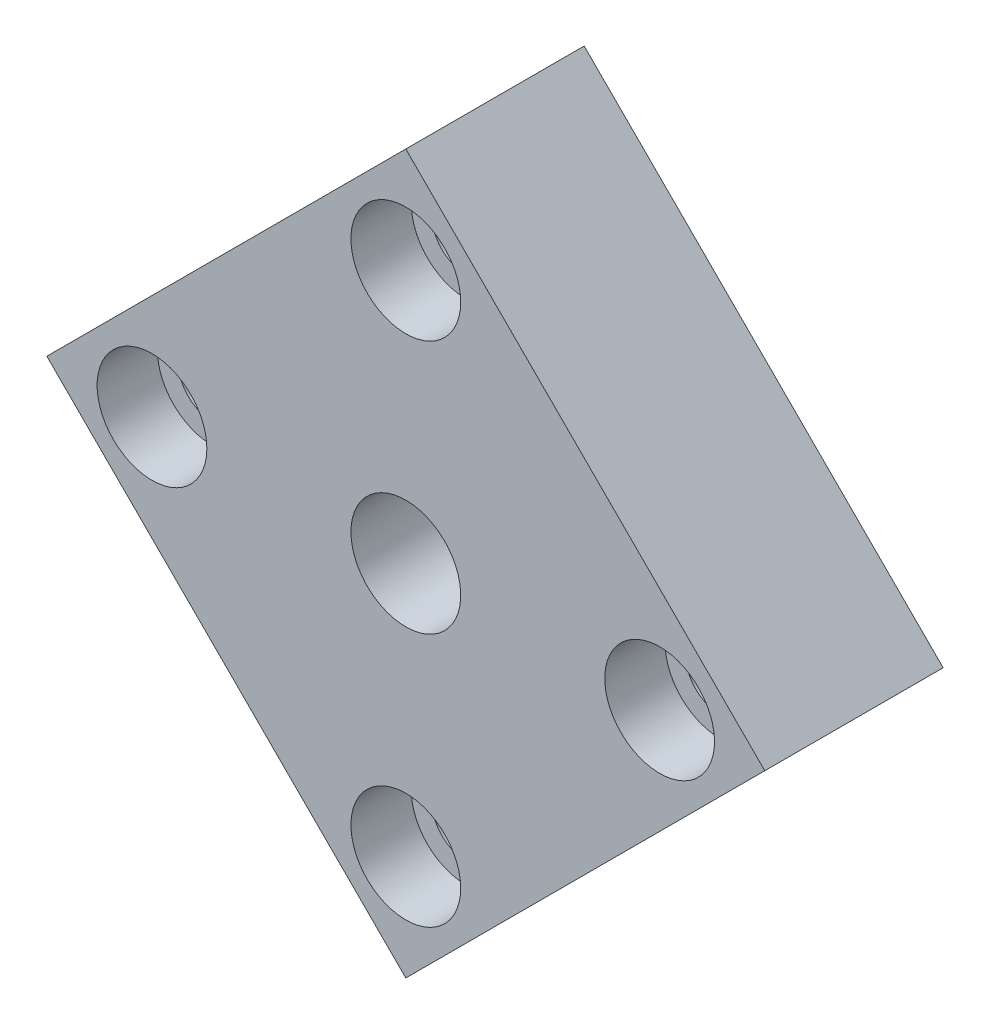
ISO-10303-21;
HEADER;
FILE_DESCRIPTION(('STEP AP214'),'2;1');
FILE_NAME('part.step','',(''),(''),'','','');
FILE_SCHEMA(('AUTOMOTIVE_DESIGN { 1 0 10303 214 1 1 1 1 }'));
ENDSEC;
DATA;
#1=APPLICATION_CONTEXT('core data for automotive mechanical design processes');
#2=APPLICATION_PROTOCOL_DEFINITION('international standard','automotive_design',2000,#1);
#3=PRODUCT_CONTEXT('',#1,'mechanical');
#4=PRODUCT('Part','Part','',(#3));
#5=PRODUCT_RELATED_PRODUCT_CATEGORY('part','',(#4));
#6=PRODUCT_DEFINITION_FORMATION('','',#4);
#7=PRODUCT_DEFINITION_CONTEXT('part definition',#1,'design');
#8=PRODUCT_DEFINITION('design','',#6,#7);
#9=PRODUCT_DEFINITION_SHAPE('','',#8);
#10=(LENGTH_UNIT() NAMED_UNIT(*) SI_UNIT(.MILLI.,.METRE.));
#11=(NAMED_UNIT(*) PLANE_ANGLE_UNIT() SI_UNIT($,.RADIAN.));
#12=(NAMED_UNIT(*) SI_UNIT($,.STERADIAN.) SOLID_ANGLE_UNIT());
#13=UNCERTAINTY_MEASURE_WITH_UNIT(LENGTH_MEASURE(1.E-05),#10,'distance_accuracy_value','');
#14=(GEOMETRIC_REPRESENTATION_CONTEXT(3) GLOBAL_UNCERTAINTY_ASSIGNED_CONTEXT((#13)) GLOBAL_UNIT_ASSIGNED_CONTEXT((#10,
#11,#12)) REPRESENTATION_CONTEXT('',''));
#15=CARTESIAN_POINT('',(0.,0.,0.));
#16=DIRECTION('',(0.,0.,1.));
#17=DIRECTION('',(1.,0.,0.));
#18=AXIS2_PLACEMENT_3D('',#15,#16,#17);
#19=CARTESIAN_POINT('',(18.5000000000002,0.,13.));
#20=DIRECTION('',(0.,0.,-1.));
#21=DIRECTION('',(-1.,0.,0.));
#22=AXIS2_PLACEMENT_3D('',#19,#20,#21);
#23=CYLINDRICAL_SURFACE('',#22,2.5);
#24=CARTESIAN_POINT('',(18.5000000000002,0.,0.));
#25=DIRECTION('',(0.,0.,1.));
#26=DIRECTION('',(1.,0.,0.));
#27=AXIS2_PLACEMENT_3D('',#24,#25,#26);
#28=CIRCLE('',#27,2.5);
#29=CARTESIAN_POINT('',(16.0000000000002,0.,0.));
#30=VERTEX_POINT('',#29);
#31=EDGE_CURVE('E111',#30,#30,#28,.T.);
#32=CARTESIAN_POINT('',(18.5000000000002,0.,8.6));
#33=DIRECTION('',(0.,0.,1.));
#34=DIRECTION('',(1.,0.,0.));
#35=AXIS2_PLACEMENT_3D('',#32,#33,#34);
#36=CIRCLE('',#35,2.5);
#37=CARTESIAN_POINT('',(16.0000000000002,0.,8.6));
#38=VERTEX_POINT('',#37);
#39=EDGE_CURVE('E45',#38,#38,#36,.T.);
#40=CARTESIAN_POINT('',(16.0000000000002,0.,0.));
#41=CARTESIAN_POINT('',(16.0000000000002,0.,0.0895833333333333));
#42=CARTESIAN_POINT('',(16.0000000000002,0.,0.179166666666667));
#43=CARTESIAN_POINT('',(16.0000000000002,0.,0.358333333333333));
#44=CARTESIAN_POINT('',(16.0000000000002,0.,0.447916666666666));
#45=CARTESIAN_POINT('',(16.0000000000002,0.,0.627083333333333));
#46=CARTESIAN_POINT('',(16.0000000000002,0.,0.716666666666666));
#47=CARTESIAN_POINT('',(16.0000000000002,0.,0.895833333333333));
#48=CARTESIAN_POINT('',(16.0000000000002,0.,0.985416666666666));
#49=CARTESIAN_POINT('',(16.0000000000002,0.,1.16458333333333));
#50=CARTESIAN_POINT('',(16.0000000000002,0.,1.25416666666667));
#51=CARTESIAN_POINT('',(16.0000000000002,0.,1.43333333333333));
#52=CARTESIAN_POINT('',(16.0000000000002,0.,1.52291666666667));
#53=CARTESIAN_POINT('',(16.0000000000002,0.,1.70208333333333));
#54=CARTESIAN_POINT('',(16.0000000000002,0.,1.79166666666667));
#55=CARTESIAN_POINT('',(16.0000000000002,0.,1.97083333333333));
#56=CARTESIAN_POINT('',(16.0000000000002,0.,2.06041666666667));
#57=CARTESIAN_POINT('',(16.0000000000002,0.,2.23958333333333));
#58=CARTESIAN_POINT('',(16.0000000000002,0.,2.32916666666667));
#59=CARTESIAN_POINT('',(16.0000000000002,0.,2.50833333333333));
#60=CARTESIAN_POINT('',(16.0000000000002,0.,2.59791666666667));
#61=CARTESIAN_POINT('',(16.0000000000002,0.,2.77708333333333));
#62=CARTESIAN_POINT('',(16.0000000000002,0.,2.86666666666667));
#63=CARTESIAN_POINT('',(16.0000000000002,0.,3.04583333333333));
#64=CARTESIAN_POINT('',(16.0000000000002,0.,3.13541666666667));
#65=CARTESIAN_POINT('',(16.0000000000002,0.,3.31458333333333));
#66=CARTESIAN_POINT('',(16.0000000000002,0.,3.40416666666667));
#67=CARTESIAN_POINT('',(16.0000000000002,0.,3.58333333333333));
#68=CARTESIAN_POINT('',(16.0000000000002,0.,3.67291666666667));
#69=CARTESIAN_POINT('',(16.0000000000002,0.,3.85208333333333));
#70=CARTESIAN_POINT('',(16.0000000000002,0.,3.94166666666667));
#71=CARTESIAN_POINT('',(16.0000000000002,0.,4.12083333333333));
#72=CARTESIAN_POINT('',(16.0000000000002,0.,4.21041666666667));
#73=CARTESIAN_POINT('',(16.0000000000002,0.,4.38958333333333));
#74=CARTESIAN_POINT('',(16.0000000000002,0.,4.47916666666667));
#75=CARTESIAN_POINT('',(16.0000000000002,0.,4.65833333333333));
#76=CARTESIAN_POINT('',(16.0000000000002,0.,4.74791666666667));
#77=CARTESIAN_POINT('',(16.0000000000002,0.,4.92708333333333));
#78=CARTESIAN_POINT('',(16.0000000000002,0.,5.01666666666667));
#79=CARTESIAN_POINT('',(16.0000000000002,0.,5.19583333333333));
#80=CARTESIAN_POINT('',(16.0000000000002,0.,5.28541666666667));
#81=CARTESIAN_POINT('',(16.0000000000002,0.,5.46458333333333));
#82=CARTESIAN_POINT('',(16.0000000000002,0.,5.55416666666667));
#83=CARTESIAN_POINT('',(16.0000000000002,0.,5.73333333333333));
#84=CARTESIAN_POINT('',(16.0000000000002,0.,5.82291666666667));
#85=CARTESIAN_POINT('',(16.0000000000002,0.,6.00208333333333));
#86=CARTESIAN_POINT('',(16.0000000000002,0.,6.09166666666667));
#87=CARTESIAN_POINT('',(16.0000000000002,0.,6.27083333333333));
#88=CARTESIAN_POINT('',(16.0000000000002,0.,6.36041666666667));
#89=CARTESIAN_POINT('',(16.0000000000002,0.,6.53958333333333));
#90=CARTESIAN_POINT('',(16.0000000000002,0.,6.62916666666667));
#91=CARTESIAN_POINT('',(16.0000000000002,0.,6.80833333333333));
#92=CARTESIAN_POINT('',(16.0000000000002,0.,6.89791666666667));
#93=CARTESIAN_POINT('',(16.0000000000002,0.,7.07708333333333));
#94=CARTESIAN_POINT('',(16.0000000000002,0.,7.16666666666667));
#95=CARTESIAN_POINT('',(16.0000000000002,0.,7.34583333333333));
#96=CARTESIAN_POINT('',(16.0000000000002,0.,7.43541666666667));
#97=CARTESIAN_POINT('',(16.0000000000002,0.,7.61458333333333));
#98=CARTESIAN_POINT('',(16.0000000000002,0.,7.70416666666667));
#99=CARTESIAN_POINT('',(16.0000000000002,0.,7.88333333333333));
#100=CARTESIAN_POINT('',(16.0000000000002,0.,7.97291666666667));
#101=CARTESIAN_POINT('',(16.0000000000002,0.,8.15208333333333));
#102=CARTESIAN_POINT('',(16.0000000000002,0.,8.24166666666667));
#103=CARTESIAN_POINT('',(16.0000000000002,0.,8.42083333333333));
#104=CARTESIAN_POINT('',(16.0000000000002,0.,8.51041666666667));
#105=CARTESIAN_POINT('',(16.0000000000002,0.,8.6));
#106=B_SPLINE_CURVE_WITH_KNOTS('',3,(#40,#41,#42,#43,#44,#45,#46,#47,#48,#49,#50,#51,#52,#53,
#54,#55,#56,#57,#58,#59,#60,#61,#62,#63,#64,#65,#66,#67,#68,#69,#70,#71,#72,#73,#74,#75,#76,#77,
#78,#79,#80,#81,#82,#83,#84,#85,#86,#87,#88,#89,#90,#91,#92,#93,#94,#95,#96,#97,#98,#99,#100,
#101,#102,#103,#104,#105),.UNSPECIFIED.,.F.,.F.,(4,2,2,2,2,2,2,2,2,2,2,2,2,2,2,2,2,2,2,2,2,2,2,
2,2,2,2,2,2,2,2,2,4),(0.,0.26875,0.5375,0.80625,1.075,1.34375,1.6125,1.88125,2.15,2.41875,
2.6875,2.95625,3.225,3.49375,3.7625,4.03125,4.3,4.56875,4.8375,5.10625,5.375,5.64375,5.9125,
6.18125,6.45,6.71875,6.9875,7.25625,7.525,7.79375,8.0625,8.33125,8.6),.UNSPECIFIED.);
#107=EDGE_CURVE('BSEAM41',#30,#38,#106,.T.);
#108=ORIENTED_EDGE('',*,*,#31,.F.);
#109=ORIENTED_EDGE('',*,*,#39,.T.);
#110=ORIENTED_EDGE('',*,*,#107,.T.);
#111=ORIENTED_EDGE('',*,*,#107,.F.);
#112=EDGE_LOOP('',(#108,#110,#109,#111));
#113=FACE_BOUND('',#112,.T.);
#114=ADVANCED_FACE('F41',(#113),#23,.F.);
#115=CARTESIAN_POINT('',(0.,-18.5000000000002,13.));
#116=DIRECTION('',(0.,0.,-1.));
#117=DIRECTION('',(-1.,0.,0.));
#118=AXIS2_PLACEMENT_3D('',#115,#116,#117);
#119=CYLINDRICAL_SURFACE('',#118,2.5);
#120=CARTESIAN_POINT('',(0.,-18.5000000000002,0.));
#121=DIRECTION('',(0.,0.,1.));
#122=DIRECTION('',(1.,0.,0.));
#123=AXIS2_PLACEMENT_3D('',#120,#121,#122);
#124=CIRCLE('',#123,2.5);
#125=CARTESIAN_POINT('',(-2.50000000000006,-18.5000000000002,0.));
#126=VERTEX_POINT('',#125);
#127=EDGE_CURVE('E137',#126,#126,#124,.T.);
#128=CARTESIAN_POINT('',(0.,-18.5000000000002,8.6));
#129=DIRECTION('',(0.,0.,1.));
#130=DIRECTION('',(1.,0.,0.));
#131=AXIS2_PLACEMENT_3D('',#128,#129,#130);
#132=CIRCLE('',#131,2.5);
#133=CARTESIAN_POINT('',(-2.50000000000006,-18.5000000000002,8.6));
#134=VERTEX_POINT('',#133);
#135=EDGE_CURVE('E123',#134,#134,#132,.T.);
#136=CARTESIAN_POINT('',(-2.50000000000006,-18.5000000000002,0.));
#137=CARTESIAN_POINT('',(-2.50000000000006,-18.5000000000002,0.0895833333333333));
#138=CARTESIAN_POINT('',(-2.50000000000006,-18.5000000000002,0.179166666666667));
#139=CARTESIAN_POINT('',(-2.50000000000006,-18.5000000000002,0.358333333333333));
#140=CARTESIAN_POINT('',(-2.50000000000006,-18.5000000000002,0.447916666666666));
#141=CARTESIAN_POINT('',(-2.50000000000006,-18.5000000000002,0.627083333333333));
#142=CARTESIAN_POINT('',(-2.50000000000006,-18.5000000000002,0.716666666666666));
#143=CARTESIAN_POINT('',(-2.50000000000006,-18.5000000000002,0.895833333333333));
#144=CARTESIAN_POINT('',(-2.50000000000006,-18.5000000000002,0.985416666666666));
#145=CARTESIAN_POINT('',(-2.50000000000006,-18.5000000000002,1.16458333333333));
#146=CARTESIAN_POINT('',(-2.50000000000006,-18.5000000000002,1.25416666666667));
#147=CARTESIAN_POINT('',(-2.50000000000006,-18.5000000000002,1.43333333333333));
#148=CARTESIAN_POINT('',(-2.50000000000006,-18.5000000000002,1.52291666666667));
#149=CARTESIAN_POINT('',(-2.50000000000006,-18.5000000000002,1.70208333333333));
#150=CARTESIAN_POINT('',(-2.50000000000006,-18.5000000000002,1.79166666666667));
#151=CARTESIAN_POINT('',(-2.50000000000006,-18.5000000000002,1.97083333333333));
#152=CARTESIAN_POINT('',(-2.50000000000006,-18.5000000000002,2.06041666666667));
#153=CARTESIAN_POINT('',(-2.50000000000006,-18.5000000000002,2.23958333333333));
#154=CARTESIAN_POINT('',(-2.50000000000006,-18.5000000000002,2.32916666666667));
#155=CARTESIAN_POINT('',(-2.50000000000006,-18.5000000000002,2.50833333333333));
#156=CARTESIAN_POINT('',(-2.50000000000006,-18.5000000000002,2.59791666666667));
#157=CARTESIAN_POINT('',(-2.50000000000006,-18.5000000000002,2.77708333333333));
#158=CARTESIAN_POINT('',(-2.50000000000006,-18.5000000000002,2.86666666666667));
#159=CARTESIAN_POINT('',(-2.50000000000006,-18.5000000000002,3.04583333333333));
#160=CARTESIAN_POINT('',(-2.50000000000006,-18.5000000000002,3.13541666666667));
#161=CARTESIAN_POINT('',(-2.50000000000006,-18.5000000000002,3.31458333333333));
#162=CARTESIAN_POINT('',(-2.50000000000006,-18.5000000000002,3.40416666666667));
#163=CARTESIAN_POINT('',(-2.50000000000006,-18.5000000000002,3.58333333333333));
#164=CARTESIAN_POINT('',(-2.50000000000006,-18.5000000000002,3.67291666666667));
#165=CARTESIAN_POINT('',(-2.50000000000006,-18.5000000000002,3.85208333333333));
#166=CARTESIAN_POINT('',(-2.50000000000006,-18.5000000000002,3.94166666666667));
#167=CARTESIAN_POINT('',(-2.50000000000006,-18.5000000000002,4.12083333333333));
#168=CARTESIAN_POINT('',(-2.50000000000006,-18.5000000000002,4.21041666666667));
#169=CARTESIAN_POINT('',(-2.50000000000006,-18.5000000000002,4.38958333333333));
#170=CARTESIAN_POINT('',(-2.50000000000006,-18.5000000000002,4.47916666666667));
#171=CARTESIAN_POINT('',(-2.50000000000006,-18.5000000000002,4.65833333333333));
#172=CARTESIAN_POINT('',(-2.50000000000006,-18.5000000000002,4.74791666666667));
#173=CARTESIAN_POINT('',(-2.50000000000006,-18.5000000000002,4.92708333333333));
#174=CARTESIAN_POINT('',(-2.50000000000006,-18.5000000000002,5.01666666666667));
#175=CARTESIAN_POINT('',(-2.50000000000006,-18.5000000000002,5.19583333333333));
#176=CARTESIAN_POINT('',(-2.50000000000006,-18.5000000000002,5.28541666666667));
#177=CARTESIAN_POINT('',(-2.50000000000006,-18.5000000000002,5.46458333333333));
#178=CARTESIAN_POINT('',(-2.50000000000006,-18.5000000000002,5.55416666666667));
#179=CARTESIAN_POINT('',(-2.50000000000006,-18.5000000000002,5.73333333333333));
#180=CARTESIAN_POINT('',(-2.50000000000006,-18.5000000000002,5.82291666666667));
#181=CARTESIAN_POINT('',(-2.50000000000006,-18.5000000000002,6.00208333333333));
#182=CARTESIAN_POINT('',(-2.50000000000006,-18.5000000000002,6.09166666666667));
#183=CARTESIAN_POINT('',(-2.50000000000006,-18.5000000000002,6.27083333333333));
#184=CARTESIAN_POINT('',(-2.50000000000006,-18.5000000000002,6.36041666666667));
#185=CARTESIAN_POINT('',(-2.50000000000006,-18.5000000000002,6.53958333333333));
#186=CARTESIAN_POINT('',(-2.50000000000006,-18.5000000000002,6.62916666666667));
#187=CARTESIAN_POINT('',(-2.50000000000006,-18.5000000000002,6.80833333333333));
#188=CARTESIAN_POINT('',(-2.50000000000006,-18.5000000000002,6.89791666666667));
#189=CARTESIAN_POINT('',(-2.50000000000006,-18.5000000000002,7.07708333333333));
#190=CARTESIAN_POINT('',(-2.50000000000006,-18.5000000000002,7.16666666666667));
#191=CARTESIAN_POINT('',(-2.50000000000006,-18.5000000000002,7.34583333333333));
#192=CARTESIAN_POINT('',(-2.50000000000006,-18.5000000000002,7.43541666666667));
#193=CARTESIAN_POINT('',(-2.50000000000006,-18.5000000000002,7.61458333333333));
#194=CARTESIAN_POINT('',(-2.50000000000006,-18.5000000000002,7.70416666666667));
#195=CARTESIAN_POINT('',(-2.50000000000006,-18.5000000000002,7.88333333333333));
#196=CARTESIAN_POINT('',(-2.50000000000006,-18.5000000000002,7.97291666666667));
#197=CARTESIAN_POINT('',(-2.50000000000006,-18.5000000000002,8.15208333333333));
#198=CARTESIAN_POINT('',(-2.50000000000006,-18.5000000000002,8.24166666666667));
#199=CARTESIAN_POINT('',(-2.50000000000006,-18.5000000000002,8.42083333333333));
#200=CARTESIAN_POINT('',(-2.50000000000006,-18.5000000000002,8.51041666666667));
#201=CARTESIAN_POINT('',(-2.50000000000006,-18.5000000000002,8.6));
#202=B_SPLINE_CURVE_WITH_KNOTS('',3,(#136,#137,#138,#139,#140,#141,#142,#143,#144,#145,#146,
#147,#148,#149,#150,#151,#152,#153,#154,#155,#156,#157,#158,#159,#160,#161,#162,#163,#164,#165,
#166,#167,#168,#169,#170,#171,#172,#173,#174,#175,#176,#177,#178,#179,#180,#181,#182,#183,#184,
#185,#186,#187,#188,#189,#190,#191,#192,#193,#194,#195,#196,#197,#198,#199,#200,#201),
.UNSPECIFIED.,.F.,.F.,(4,2,2,2,2,2,2,2,2,2,2,2,2,2,2,2,2,2,2,2,2,2,2,2,2,2,2,2,2,2,2,2,4),(0.,
0.26875,0.5375,0.80625,1.075,1.34375,1.6125,1.88125,2.15,2.41875,2.6875,2.95625,3.225,3.49375,
3.7625,4.03125,4.3,4.56875,4.8375,5.10625,5.375,5.64375,5.9125,6.18125,6.45,6.71875,6.9875,
7.25625,7.525,7.79375,8.0625,8.33125,8.6),.UNSPECIFIED.);
#203=EDGE_CURVE('BSEAM158',#126,#134,#202,.T.);
#204=ORIENTED_EDGE('',*,*,#127,.F.);
#205=ORIENTED_EDGE('',*,*,#135,.T.);
#206=ORIENTED_EDGE('',*,*,#203,.T.);
#207=ORIENTED_EDGE('',*,*,#203,.F.);
#208=EDGE_LOOP('',(#204,#206,#205,#207));
#209=FACE_BOUND('',#208,.T.);
#210=ADVANCED_FACE('F158',(#209),#119,.F.);
#211=CARTESIAN_POINT('',(-18.5000000000002,1.29184809537197E-13,13.));
#212=DIRECTION('',(0.,0.,-1.));
#213=DIRECTION('',(-1.,0.,0.));
#214=AXIS2_PLACEMENT_3D('',#211,#212,#213);
#215=CYLINDRICAL_SURFACE('',#214,2.5);
#216=CARTESIAN_POINT('',(-18.5000000000002,1.29184809537197E-13,0.));
#217=DIRECTION('',(0.,0.,1.));
#218=DIRECTION('',(1.,0.,0.));
#219=AXIS2_PLACEMENT_3D('',#216,#217,#218);
#220=CIRCLE('',#219,2.5);
#221=CARTESIAN_POINT('',(-21.0000000000001,1.29184809537197E-13,0.));
#222=VERTEX_POINT('',#221);
#223=EDGE_CURVE('E132',#222,#222,#220,.T.);
#224=CARTESIAN_POINT('',(-18.5000000000002,1.29184809537197E-13,8.6));
#225=DIRECTION('',(0.,0.,1.));
#226=DIRECTION('',(1.,0.,0.));
#227=AXIS2_PLACEMENT_3D('',#224,#225,#226);
#228=CIRCLE('',#227,2.5);
#229=CARTESIAN_POINT('',(-21.0000000000001,1.29184809537197E-13,8.6));
#230=VERTEX_POINT('',#229);
#231=EDGE_CURVE('E120',#230,#230,#228,.T.);
#232=CARTESIAN_POINT('',(-21.0000000000001,1.29184809537197E-13,0.));
#233=CARTESIAN_POINT('',(-21.0000000000001,1.29184809537197E-13,0.0895833333333333));
#234=CARTESIAN_POINT('',(-21.0000000000001,1.29184809537197E-13,0.179166666666667));
#235=CARTESIAN_POINT('',(-21.0000000000001,1.29184809537197E-13,0.358333333333333));
#236=CARTESIAN_POINT('',(-21.0000000000001,1.29184809537197E-13,0.447916666666666));
#237=CARTESIAN_POINT('',(-21.0000000000001,1.29184809537197E-13,0.627083333333333));
#238=CARTESIAN_POINT('',(-21.0000000000001,1.29184809537197E-13,0.716666666666666));
#239=CARTESIAN_POINT('',(-21.0000000000001,1.29184809537197E-13,0.895833333333333));
#240=CARTESIAN_POINT('',(-21.0000000000001,1.29184809537197E-13,0.985416666666666));
#241=CARTESIAN_POINT('',(-21.0000000000001,1.29184809537197E-13,1.16458333333333));
#242=CARTESIAN_POINT('',(-21.0000000000001,1.29184809537197E-13,1.25416666666667));
#243=CARTESIAN_POINT('',(-21.0000000000001,1.29184809537197E-13,1.43333333333333));
#244=CARTESIAN_POINT('',(-21.0000000000001,1.29184809537197E-13,1.52291666666667));
#245=CARTESIAN_POINT('',(-21.0000000000001,1.29184809537197E-13,1.70208333333333));
#246=CARTESIAN_POINT('',(-21.0000000000001,1.29184809537197E-13,1.79166666666667));
#247=CARTESIAN_POINT('',(-21.0000000000001,1.29184809537197E-13,1.97083333333333));
#248=CARTESIAN_POINT('',(-21.0000000000001,1.29184809537197E-13,2.06041666666667));
#249=CARTESIAN_POINT('',(-21.0000000000001,1.29184809537197E-13,2.23958333333333));
#250=CARTESIAN_POINT('',(-21.0000000000001,1.29184809537197E-13,2.32916666666667));
#251=CARTESIAN_POINT('',(-21.0000000000001,1.29184809537197E-13,2.50833333333333));
#252=CARTESIAN_POINT('',(-21.0000000000001,1.29184809537197E-13,2.59791666666667));
#253=CARTESIAN_POINT('',(-21.0000000000001,1.29184809537197E-13,2.77708333333333));
#254=CARTESIAN_POINT('',(-21.0000000000001,1.29184809537197E-13,2.86666666666667));
#255=CARTESIAN_POINT('',(-21.0000000000001,1.29184809537197E-13,3.04583333333333));
#256=CARTESIAN_POINT('',(-21.0000000000001,1.29184809537197E-13,3.13541666666667));
#257=CARTESIAN_POINT('',(-21.0000000000001,1.29184809537197E-13,3.31458333333333));
#258=CARTESIAN_POINT('',(-21.0000000000001,1.29184809537197E-13,3.40416666666667));
#259=CARTESIAN_POINT('',(-21.0000000000001,1.29184809537197E-13,3.58333333333333));
#260=CARTESIAN_POINT('',(-21.0000000000001,1.29184809537197E-13,3.67291666666667));
#261=CARTESIAN_POINT('',(-21.0000000000001,1.29184809537197E-13,3.85208333333333));
#262=CARTESIAN_POINT('',(-21.0000000000001,1.29184809537197E-13,3.94166666666667));
#263=CARTESIAN_POINT('',(-21.0000000000001,1.29184809537197E-13,4.12083333333333));
#264=CARTESIAN_POINT('',(-21.0000000000001,1.29184809537197E-13,4.21041666666667));
#265=CARTESIAN_POINT('',(-21.0000000000001,1.29184809537197E-13,4.38958333333333));
#266=CARTESIAN_POINT('',(-21.0000000000001,1.29184809537197E-13,4.47916666666667));
#267=CARTESIAN_POINT('',(-21.0000000000001,1.29184809537197E-13,4.65833333333333));
#268=CARTESIAN_POINT('',(-21.0000000000001,1.29184809537197E-13,4.74791666666667));
#269=CARTESIAN_POINT('',(-21.0000000000001,1.29184809537197E-13,4.92708333333333));
#270=CARTESIAN_POINT('',(-21.0000000000001,1.29184809537197E-13,5.01666666666667));
#271=CARTESIAN_POINT('',(-21.0000000000001,1.29184809537197E-13,5.19583333333333));
#272=CARTESIAN_POINT('',(-21.0000000000001,1.29184809537197E-13,5.28541666666667));
#273=CARTESIAN_POINT('',(-21.0000000000001,1.29184809537197E-13,5.46458333333333));
#274=CARTESIAN_POINT('',(-21.0000000000001,1.29184809537197E-13,5.55416666666667));
#275=CARTESIAN_POINT('',(-21.0000000000001,1.29184809537197E-13,5.73333333333333));
#276=CARTESIAN_POINT('',(-21.0000000000001,1.29184809537197E-13,5.82291666666667));
#277=CARTESIAN_POINT('',(-21.0000000000001,1.29184809537197E-13,6.00208333333333));
#278=CARTESIAN_POINT('',(-21.0000000000001,1.29184809537197E-13,6.09166666666667));
#279=CARTESIAN_POINT('',(-21.0000000000001,1.29184809537197E-13,6.27083333333333));
#280=CARTESIAN_POINT('',(-21.0000000000001,1.29184809537197E-13,6.36041666666667));
#281=CARTESIAN_POINT('',(-21.0000000000001,1.29184809537197E-13,6.53958333333333));
#282=CARTESIAN_POINT('',(-21.0000000000001,1.29184809537197E-13,6.62916666666667));
#283=CARTESIAN_POINT('',(-21.0000000000001,1.29184809537197E-13,6.80833333333333));
#284=CARTESIAN_POINT('',(-21.0000000000001,1.29184809537197E-13,6.89791666666667));
#285=CARTESIAN_POINT('',(-21.0000000000001,1.29184809537197E-13,7.07708333333333));
#286=CARTESIAN_POINT('',(-21.0000000000001,1.29184809537197E-13,7.16666666666667));
#287=CARTESIAN_POINT('',(-21.0000000000001,1.29184809537197E-13,7.34583333333333));
#288=CARTESIAN_POINT('',(-21.0000000000001,1.29184809537197E-13,7.43541666666667));
#289=CARTESIAN_POINT('',(-21.0000000000001,1.29184809537197E-13,7.61458333333333));
#290=CARTESIAN_POINT('',(-21.0000000000001,1.29184809537197E-13,7.70416666666667));
#291=CARTESIAN_POINT('',(-21.0000000000001,1.29184809537197E-13,7.88333333333333));
#292=CARTESIAN_POINT('',(-21.0000000000001,1.29184809537197E-13,7.97291666666667));
#293=CARTESIAN_POINT('',(-21.0000000000001,1.29184809537197E-13,8.15208333333333));
#294=CARTESIAN_POINT('',(-21.0000000000001,1.29184809537197E-13,8.24166666666667));
#295=CARTESIAN_POINT('',(-21.0000000000001,1.29184809537197E-13,8.42083333333333));
#296=CARTESIAN_POINT('',(-21.0000000000001,1.29184809537197E-13,8.51041666666667));
#297=CARTESIAN_POINT('',(-21.0000000000001,1.29184809537197E-13,8.6));
#298=B_SPLINE_CURVE_WITH_KNOTS('',3,(#232,#233,#234,#235,#236,#237,#238,#239,#240,#241,#242,
#243,#244,#245,#246,#247,#248,#249,#250,#251,#252,#253,#254,#255,#256,#257,#258,#259,#260,#261,
#262,#263,#264,#265,#266,#267,#268,#269,#270,#271,#272,#273,#274,#275,#276,#277,#278,#279,#280,
#281,#282,#283,#284,#285,#286,#287,#288,#289,#290,#291,#292,#293,#294,#295,#296,#297),
.UNSPECIFIED.,.F.,.F.,(4,2,2,2,2,2,2,2,2,2,2,2,2,2,2,2,2,2,2,2,2,2,2,2,2,2,2,2,2,2,2,2,4),(0.,
0.26875,0.5375,0.80625,1.075,1.34375,1.6125,1.88125,2.15,2.41875,2.6875,2.95625,3.225,3.49375,
3.7625,4.03125,4.3,4.56875,4.8375,5.10625,5.375,5.64375,5.9125,6.18125,6.45,6.71875,6.9875,
7.25625,7.525,7.79375,8.0625,8.33125,8.6),.UNSPECIFIED.);
#299=EDGE_CURVE('BSEAM164',#222,#230,#298,.T.);
#300=ORIENTED_EDGE('',*,*,#223,.F.);
#301=ORIENTED_EDGE('',*,*,#231,.T.);
#302=ORIENTED_EDGE('',*,*,#299,.T.);
#303=ORIENTED_EDGE('',*,*,#299,.F.);
#304=EDGE_LOOP('',(#300,#302,#301,#303));
#305=FACE_BOUND('',#304,.T.);
#306=ADVANCED_FACE('F164',(#305),#215,.F.);
#307=CARTESIAN_POINT('',(1.93777214305796E-13,18.5000000000002,13.));
#308=DIRECTION('',(0.,0.,-1.));
#309=DIRECTION('',(-1.,0.,0.));
#310=AXIS2_PLACEMENT_3D('',#307,#308,#309);
#311=CYLINDRICAL_SURFACE('',#310,2.5);
#312=CARTESIAN_POINT('',(1.93777214305796E-13,18.5000000000002,0.));
#313=DIRECTION('',(0.,0.,1.));
#314=DIRECTION('',(1.,0.,0.));
#315=AXIS2_PLACEMENT_3D('',#312,#313,#314);
#316=CIRCLE('',#315,2.5);
#317=CARTESIAN_POINT('',(-2.4999999999998,18.5000000000002,0.));
#318=VERTEX_POINT('',#317);
#319=EDGE_CURVE('E128',#318,#318,#316,.T.);
#320=CARTESIAN_POINT('',(1.93777214305796E-13,18.5000000000002,8.6));
#321=DIRECTION('',(0.,0.,1.));
#322=DIRECTION('',(1.,0.,0.));
#323=AXIS2_PLACEMENT_3D('',#320,#321,#322);
#324=CIRCLE('',#323,2.5);
#325=CARTESIAN_POINT('',(-2.4999999999998,18.5000000000002,8.6));
#326=VERTEX_POINT('',#325);
#327=EDGE_CURVE('E117',#326,#326,#324,.T.);
#328=CARTESIAN_POINT('',(-2.4999999999998,18.5000000000002,0.));
#329=CARTESIAN_POINT('',(-2.4999999999998,18.5000000000002,0.0895833333333333));
#330=CARTESIAN_POINT('',(-2.4999999999998,18.5000000000002,0.179166666666667));
#331=CARTESIAN_POINT('',(-2.4999999999998,18.5000000000002,0.358333333333333));
#332=CARTESIAN_POINT('',(-2.4999999999998,18.5000000000002,0.447916666666666));
#333=CARTESIAN_POINT('',(-2.4999999999998,18.5000000000002,0.627083333333333));
#334=CARTESIAN_POINT('',(-2.4999999999998,18.5000000000002,0.716666666666666));
#335=CARTESIAN_POINT('',(-2.4999999999998,18.5000000000002,0.895833333333333));
#336=CARTESIAN_POINT('',(-2.4999999999998,18.5000000000002,0.985416666666666));
#337=CARTESIAN_POINT('',(-2.4999999999998,18.5000000000002,1.16458333333333));
#338=CARTESIAN_POINT('',(-2.4999999999998,18.5000000000002,1.25416666666667));
#339=CARTESIAN_POINT('',(-2.4999999999998,18.5000000000002,1.43333333333333));
#340=CARTESIAN_POINT('',(-2.4999999999998,18.5000000000002,1.52291666666667));
#341=CARTESIAN_POINT('',(-2.4999999999998,18.5000000000002,1.70208333333333));
#342=CARTESIAN_POINT('',(-2.4999999999998,18.5000000000002,1.79166666666667));
#343=CARTESIAN_POINT('',(-2.4999999999998,18.5000000000002,1.97083333333333));
#344=CARTESIAN_POINT('',(-2.4999999999998,18.5000000000002,2.06041666666667));
#345=CARTESIAN_POINT('',(-2.4999999999998,18.5000000000002,2.23958333333333));
#346=CARTESIAN_POINT('',(-2.4999999999998,18.5000000000002,2.32916666666667));
#347=CARTESIAN_POINT('',(-2.4999999999998,18.5000000000002,2.50833333333333));
#348=CARTESIAN_POINT('',(-2.4999999999998,18.5000000000002,2.59791666666667));
#349=CARTESIAN_POINT('',(-2.4999999999998,18.5000000000002,2.77708333333333));
#350=CARTESIAN_POINT('',(-2.4999999999998,18.5000000000002,2.86666666666667));
#351=CARTESIAN_POINT('',(-2.4999999999998,18.5000000000002,3.04583333333333));
#352=CARTESIAN_POINT('',(-2.4999999999998,18.5000000000002,3.13541666666667));
#353=CARTESIAN_POINT('',(-2.4999999999998,18.5000000000002,3.31458333333333));
#354=CARTESIAN_POINT('',(-2.4999999999998,18.5000000000002,3.40416666666667));
#355=CARTESIAN_POINT('',(-2.4999999999998,18.5000000000002,3.58333333333333));
#356=CARTESIAN_POINT('',(-2.4999999999998,18.5000000000002,3.67291666666667));
#357=CARTESIAN_POINT('',(-2.4999999999998,18.5000000000002,3.85208333333333));
#358=CARTESIAN_POINT('',(-2.4999999999998,18.5000000000002,3.94166666666667));
#359=CARTESIAN_POINT('',(-2.4999999999998,18.5000000000002,4.12083333333333));
#360=CARTESIAN_POINT('',(-2.4999999999998,18.5000000000002,4.21041666666667));
#361=CARTESIAN_POINT('',(-2.4999999999998,18.5000000000002,4.38958333333333));
#362=CARTESIAN_POINT('',(-2.4999999999998,18.5000000000002,4.47916666666667));
#363=CARTESIAN_POINT('',(-2.4999999999998,18.5000000000002,4.65833333333333));
#364=CARTESIAN_POINT('',(-2.4999999999998,18.5000000000002,4.74791666666667));
#365=CARTESIAN_POINT('',(-2.4999999999998,18.5000000000002,4.92708333333333));
#366=CARTESIAN_POINT('',(-2.4999999999998,18.5000000000002,5.01666666666667));
#367=CARTESIAN_POINT('',(-2.4999999999998,18.5000000000002,5.19583333333333));
#368=CARTESIAN_POINT('',(-2.4999999999998,18.5000000000002,5.28541666666667));
#369=CARTESIAN_POINT('',(-2.4999999999998,18.5000000000002,5.46458333333333));
#370=CARTESIAN_POINT('',(-2.4999999999998,18.5000000000002,5.55416666666667));
#371=CARTESIAN_POINT('',(-2.4999999999998,18.5000000000002,5.73333333333333));
#372=CARTESIAN_POINT('',(-2.4999999999998,18.5000000000002,5.82291666666667));
#373=CARTESIAN_POINT('',(-2.4999999999998,18.5000000000002,6.00208333333333));
#374=CARTESIAN_POINT('',(-2.4999999999998,18.5000000000002,6.09166666666667));
#375=CARTESIAN_POINT('',(-2.4999999999998,18.5000000000002,6.27083333333333));
#376=CARTESIAN_POINT('',(-2.4999999999998,18.5000000000002,6.36041666666667));
#377=CARTESIAN_POINT('',(-2.4999999999998,18.5000000000002,6.53958333333333));
#378=CARTESIAN_POINT('',(-2.4999999999998,18.5000000000002,6.62916666666667));
#379=CARTESIAN_POINT('',(-2.4999999999998,18.5000000000002,6.80833333333333));
#380=CARTESIAN_POINT('',(-2.4999999999998,18.5000000000002,6.89791666666667));
#381=CARTESIAN_POINT('',(-2.4999999999998,18.5000000000002,7.07708333333333));
#382=CARTESIAN_POINT('',(-2.4999999999998,18.5000000000002,7.16666666666667));
#383=CARTESIAN_POINT('',(-2.4999999999998,18.5000000000002,7.34583333333333));
#384=CARTESIAN_POINT('',(-2.4999999999998,18.5000000000002,7.43541666666667));
#385=CARTESIAN_POINT('',(-2.4999999999998,18.5000000000002,7.61458333333333));
#386=CARTESIAN_POINT('',(-2.4999999999998,18.5000000000002,7.70416666666667));
#387=CARTESIAN_POINT('',(-2.4999999999998,18.5000000000002,7.88333333333333));
#388=CARTESIAN_POINT('',(-2.4999999999998,18.5000000000002,7.97291666666667));
#389=CARTESIAN_POINT('',(-2.4999999999998,18.5000000000002,8.15208333333333));
#390=CARTESIAN_POINT('',(-2.4999999999998,18.5000000000002,8.24166666666667));
#391=CARTESIAN_POINT('',(-2.4999999999998,18.5000000000002,8.42083333333333));
#392=CARTESIAN_POINT('',(-2.4999999999998,18.5000000000002,8.51041666666667));
#393=CARTESIAN_POINT('',(-2.4999999999998,18.5000000000002,8.6));
#394=B_SPLINE_CURVE_WITH_KNOTS('',3,(#328,#329,#330,#331,#332,#333,#334,#335,#336,#337,#338,
#339,#340,#341,#342,#343,#344,#345,#346,#347,#348,#349,#350,#351,#352,#353,#354,#355,#356,#357,
#358,#359,#360,#361,#362,#363,#364,#365,#366,#367,#368,#369,#370,#371,#372,#373,#374,#375,#376,
#377,#378,#379,#380,#381,#382,#383,#384,#385,#386,#387,#388,#389,#390,#391,#392,#393),
.UNSPECIFIED.,.F.,.F.,(4,2,2,2,2,2,2,2,2,2,2,2,2,2,2,2,2,2,2,2,2,2,2,2,2,2,2,2,2,2,2,2,4),(0.,
0.26875,0.5375,0.80625,1.075,1.34375,1.6125,1.88125,2.15,2.41875,2.6875,2.95625,3.225,3.49375,
3.7625,4.03125,4.3,4.56875,4.8375,5.10625,5.375,5.64375,5.9125,6.18125,6.45,6.71875,6.9875,
7.25625,7.525,7.79375,8.0625,8.33125,8.6),.UNSPECIFIED.);
#395=EDGE_CURVE('BSEAM172',#318,#326,#394,.T.);
#396=ORIENTED_EDGE('',*,*,#319,.F.);
#397=ORIENTED_EDGE('',*,*,#327,.T.);
#398=ORIENTED_EDGE('',*,*,#395,.T.);
#399=ORIENTED_EDGE('',*,*,#395,.F.);
#400=EDGE_LOOP('',(#396,#398,#397,#399));
#401=FACE_BOUND('',#400,.T.);
#402=ADVANCED_FACE('F172',(#401),#311,.F.);
#403=CARTESIAN_POINT('',(0.,0.,13.));
#404=DIRECTION('',(0.,0.,1.));
#405=DIRECTION('',(1.,0.,0.));
#406=AXIS2_PLACEMENT_3D('',#403,#404,#405);
#407=PLANE('',#406);
#408=CARTESIAN_POINT('',(18.5000000000002,0.,13.));
#409=DIRECTION('',(0.,0.,1.));
#410=DIRECTION('',(1.,0.,0.));
#411=AXIS2_PLACEMENT_3D('',#408,#409,#410);
#412=CIRCLE('',#411,4.);
#413=CARTESIAN_POINT('',(22.5000000000002,0.,13.));
#414=VERTEX_POINT('',#413);
#415=EDGE_CURVE('E362',#414,#414,#412,.T.);
#416=ORIENTED_EDGE('',*,*,#415,.F.);
#417=EDGE_LOOP('',(#416));
#418=FACE_BOUND('',#417,.T.);
#419=CARTESIAN_POINT('',(0.,-18.5000000000002,13.));
#420=DIRECTION('',(0.,0.,1.));
#421=DIRECTION('',(1.,0.,0.));
#422=AXIS2_PLACEMENT_3D('',#419,#420,#421);
#423=CIRCLE('',#422,4.);
#424=CARTESIAN_POINT('',(3.99999999999993,-18.5000000000002,13.));
#425=VERTEX_POINT('',#424);
#426=EDGE_CURVE('E359',#425,#425,#423,.T.);
#427=ORIENTED_EDGE('',*,*,#426,.F.);
#428=EDGE_LOOP('',(#427));
#429=FACE_BOUND('',#428,.T.);
#430=CARTESIAN_POINT('',(-18.5000000000002,1.29184809537197E-13,13.));
#431=DIRECTION('',(0.,0.,1.));
#432=DIRECTION('',(1.,0.,0.));
#433=AXIS2_PLACEMENT_3D('',#430,#431,#432);
#434=CIRCLE('',#433,4.);
#435=CARTESIAN_POINT('',(-14.5000000000002,1.29184809537197E-13,13.));
#436=VERTEX_POINT('',#435);
#437=EDGE_CURVE('E349',#436,#436,#434,.T.);
#438=ORIENTED_EDGE('',*,*,#437,.F.);
#439=EDGE_LOOP('',(#438));
#440=FACE_BOUND('',#439,.T.);
#441=CARTESIAN_POINT('',(1.93777214305796E-13,18.5000000000002,13.));
#442=DIRECTION('',(0.,0.,1.));
#443=DIRECTION('',(1.,0.,0.));
#444=AXIS2_PLACEMENT_3D('',#441,#442,#443);
#445=CIRCLE('',#444,4.);
#446=CARTESIAN_POINT('',(4.00000000000019,18.5000000000002,13.));
#447=VERTEX_POINT('',#446);
#448=EDGE_CURVE('E350',#447,#447,#445,.T.);
#449=ORIENTED_EDGE('',*,*,#448,.F.);
#450=EDGE_LOOP('',(#449));
#451=FACE_BOUND('',#450,.T.);
#452=CARTESIAN_POINT('',(0.,0.,13.));
#453=DIRECTION('',(0.,0.,1.));
#454=DIRECTION('',(1.,0.,0.));
#455=AXIS2_PLACEMENT_3D('',#452,#453,#454);
#456=CIRCLE('',#455,4.);
#457=CARTESIAN_POINT('',(-4.,0.,13.));
#458=VERTEX_POINT('',#457);
#459=EDGE_CURVE('E146',#458,#458,#456,.T.);
#460=ORIENTED_EDGE('',*,*,#459,.F.);
#461=EDGE_LOOP('',(#460));
#462=FACE_BOUND('',#461,.T.);
#463=DIRECTION('',(-0.707106781186551,0.707106781186544,0.));
#464=VECTOR('',#463,1.);
#465=CARTESIAN_POINT('',(26.1629509039024,2.72440345846097E-13,13.));
#466=LINE('',#465,#464);
#467=CARTESIAN_POINT('',(26.1629509039024,2.72440345846097E-13,13.));
#468=VERTEX_POINT('',#467);
#469=CARTESIAN_POINT('',(0.,26.1629509039024,13.));
#470=VERTEX_POINT('',#469);
#471=EDGE_CURVE('E95',#468,#470,#466,.T.);
#472=ORIENTED_EDGE('',*,*,#471,.T.);
#473=DIRECTION('',(-0.707106781186546,-0.707106781186549,0.));
#474=VECTOR('',#473,1.);
#475=CARTESIAN_POINT('',(0.,26.1629509039024,13.));
#476=LINE('',#475,#474);
#477=CARTESIAN_POINT('',(-26.1629509039024,0.,13.));
#478=VERTEX_POINT('',#477);
#479=EDGE_CURVE('E90',#470,#478,#476,.T.);
#480=ORIENTED_EDGE('',*,*,#479,.T.);
#481=DIRECTION('',(0.707106781186551,-0.707106781186544,0.));
#482=VECTOR('',#481,1.);
#483=CARTESIAN_POINT('',(-26.1629509039024,0.,13.));
#484=LINE('',#483,#482);
#485=CARTESIAN_POINT('',(1.82694909700089E-13,-26.1629509039024,13.));
#486=VERTEX_POINT('',#485);
#487=EDGE_CURVE('E93',#478,#486,#484,.T.);
#488=ORIENTED_EDGE('',*,*,#487,.T.);
#489=DIRECTION('',(0.707106781186541,0.707106781186554,0.));
#490=VECTOR('',#489,1.);
#491=CARTESIAN_POINT('',(1.82694909700089E-13,-26.1629509039024,13.));
#492=LINE('',#491,#490);
#493=EDGE_CURVE('E60',#486,#468,#492,.T.);
#494=ORIENTED_EDGE('',*,*,#493,.T.);
#495=EDGE_LOOP('',(#472,#480,#488,#494));
#496=FACE_BOUND('',#495,.T.);
#497=ADVANCED_FACE('F91',(#418,#429,#440,#451,#462,#496),#407,.T.);
#498=CARTESIAN_POINT('',(0.,0.,0.));
#499=DIRECTION('',(0.,0.,1.));
#500=DIRECTION('',(1.,0.,0.));
#501=AXIS2_PLACEMENT_3D('',#498,#499,#500);
#502=PLANE('',#501);
#503=DIRECTION('',(-0.707106781186551,0.707106781186544,0.));
#504=VECTOR('',#503,1.);
#505=CARTESIAN_POINT('',(26.1629509039024,2.72440345846097E-13,0.));
#506=LINE('',#505,#504);
#507=CARTESIAN_POINT('',(26.1629509039024,2.72440345846097E-13,0.));
#508=VERTEX_POINT('',#507);
#509=CARTESIAN_POINT('',(0.,26.1629509039024,0.));
#510=VERTEX_POINT('',#509);
#511=EDGE_CURVE('E108',#508,#510,#506,.T.);
#512=ORIENTED_EDGE('',*,*,#511,.F.);
#513=DIRECTION('',(0.707106781186541,0.707106781186554,0.));
#514=VECTOR('',#513,1.);
#515=CARTESIAN_POINT('',(1.82694909700089E-13,-26.1629509039024,0.));
#516=LINE('',#515,#514);
#517=CARTESIAN_POINT('',(1.82694909700089E-13,-26.1629509039024,0.));
#518=VERTEX_POINT('',#517);
#519=EDGE_CURVE('E83',#518,#508,#516,.T.);
#520=ORIENTED_EDGE('',*,*,#519,.F.);
#521=DIRECTION('',(0.707106781186551,-0.707106781186544,0.));
#522=VECTOR('',#521,1.);
#523=CARTESIAN_POINT('',(-26.1629509039024,0.,0.));
#524=LINE('',#523,#522);
#525=CARTESIAN_POINT('',(-26.1629509039024,0.,0.));
#526=VERTEX_POINT('',#525);
#527=EDGE_CURVE('E77',#526,#518,#524,.T.);
#528=ORIENTED_EDGE('',*,*,#527,.F.);
#529=DIRECTION('',(-0.707106781186546,-0.707106781186549,0.));
#530=VECTOR('',#529,1.);
#531=CARTESIAN_POINT('',(0.,26.1629509039024,0.));
#532=LINE('',#531,#530);
#533=EDGE_CURVE('E99',#510,#526,#532,.T.);
#534=ORIENTED_EDGE('',*,*,#533,.F.);
#535=EDGE_LOOP('',(#512,#520,#528,#534));
#536=FACE_BOUND('',#535,.T.);
#537=ORIENTED_EDGE('',*,*,#31,.T.);
#538=EDGE_LOOP('',(#537));
#539=FACE_BOUND('',#538,.T.);
#540=CARTESIAN_POINT('',(0.,0.,0.));
#541=DIRECTION('',(0.,0.,1.));
#542=DIRECTION('',(1.,0.,0.));
#543=AXIS2_PLACEMENT_3D('',#540,#541,#542);
#544=CIRCLE('',#543,4.);
#545=CARTESIAN_POINT('',(-4.,0.,0.));
#546=VERTEX_POINT('',#545);
#547=EDGE_CURVE('E145',#546,#546,#544,.T.);
#548=ORIENTED_EDGE('',*,*,#547,.T.);
#549=EDGE_LOOP('',(#548));
#550=FACE_BOUND('',#549,.T.);
#551=ORIENTED_EDGE('',*,*,#127,.T.);
#552=EDGE_LOOP('',(#551));
#553=FACE_BOUND('',#552,.T.);
#554=ORIENTED_EDGE('',*,*,#223,.T.);
#555=EDGE_LOOP('',(#554));
#556=FACE_BOUND('',#555,.T.);
#557=ORIENTED_EDGE('',*,*,#319,.T.);
#558=EDGE_LOOP('',(#557));
#559=FACE_BOUND('',#558,.T.);
#560=ADVANCED_FACE('F154',(#536,#539,#550,#553,#556,#559),#502,.F.);
#561=CARTESIAN_POINT('',(26.1629509039024,2.72440345846097E-13,13.));
#562=DIRECTION('',(-0.707106781186544,-0.707106781186551,0.));
#563=DIRECTION('',(0.707106781186551,-0.707106781186544,0.));
#564=AXIS2_PLACEMENT_3D('',#561,#562,#563);
#565=PLANE('',#564);
#566=ORIENTED_EDGE('',*,*,#511,.T.);
#567=DIRECTION('',(0.,0.,-1.));
#568=VECTOR('',#567,1.);
#569=CARTESIAN_POINT('',(0.,26.1629509039024,13.));
#570=LINE('',#569,#568);
#571=EDGE_CURVE('E11',#470,#510,#570,.T.);
#572=ORIENTED_EDGE('',*,*,#571,.F.);
#573=ORIENTED_EDGE('',*,*,#471,.F.);
#574=DIRECTION('',(0.,0.,-1.));
#575=VECTOR('',#574,1.);
#576=CARTESIAN_POINT('',(26.1629509039024,2.72440345846097E-13,13.));
#577=LINE('',#576,#575);
#578=EDGE_CURVE('E104',#468,#508,#577,.T.);
#579=ORIENTED_EDGE('',*,*,#578,.T.);
#580=EDGE_LOOP('',(#566,#572,#573,#579));
#581=FACE_BOUND('',#580,.T.);
#582=ADVANCED_FACE('F43',(#581),#565,.F.);
#583=CARTESIAN_POINT('',(0.,26.1629509039024,13.));
#584=DIRECTION('',(0.707106781186549,-0.707106781186546,0.));
#585=DIRECTION('',(0.707106781186546,0.707106781186549,0.));
#586=AXIS2_PLACEMENT_3D('',#583,#584,#585);
#587=PLANE('',#586);
#588=ORIENTED_EDGE('',*,*,#533,.T.);
#589=DIRECTION('',(0.,0.,-1.));
#590=VECTOR('',#589,1.);
#591=CARTESIAN_POINT('',(-26.1629509039024,0.,13.));
#592=LINE('',#591,#590);
#593=EDGE_CURVE('E51',#478,#526,#592,.T.);
#594=ORIENTED_EDGE('',*,*,#593,.F.);
#595=ORIENTED_EDGE('',*,*,#479,.F.);
#596=ORIENTED_EDGE('',*,*,#571,.T.);
#597=EDGE_LOOP('',(#588,#594,#595,#596));
#598=FACE_BOUND('',#597,.T.);
#599=ADVANCED_FACE('F98',(#598),#587,.F.);
#600=CARTESIAN_POINT('',(-26.1629509039024,0.,13.));
#601=DIRECTION('',(0.707106781186544,0.707106781186551,0.));
#602=DIRECTION('',(-0.707106781186551,0.707106781186544,0.));
#603=AXIS2_PLACEMENT_3D('',#600,#601,#602);
#604=PLANE('',#603);
#605=ORIENTED_EDGE('',*,*,#527,.T.);
#606=DIRECTION('',(0.,0.,-1.));
#607=VECTOR('',#606,1.);
#608=CARTESIAN_POINT('',(1.82694909700089E-13,-26.1629509039024,13.));
#609=LINE('',#608,#607);
#610=EDGE_CURVE('E100',#486,#518,#609,.T.);
#611=ORIENTED_EDGE('',*,*,#610,.F.);
#612=ORIENTED_EDGE('',*,*,#487,.F.);
#613=ORIENTED_EDGE('',*,*,#593,.T.);
#614=EDGE_LOOP('',(#605,#611,#612,#613));
#615=FACE_BOUND('',#614,.T.);
#616=ADVANCED_FACE('F102',(#615),#604,.F.);
#617=CARTESIAN_POINT('',(1.82694909700089E-13,-26.1629509039024,13.));
#618=DIRECTION('',(-0.707106781186554,0.707106781186541,0.));
#619=DIRECTION('',(-0.707106781186541,-0.707106781186554,0.));
#620=AXIS2_PLACEMENT_3D('',#617,#618,#619);
#621=PLANE('',#620);
#622=ORIENTED_EDGE('',*,*,#519,.T.);
#623=ORIENTED_EDGE('',*,*,#578,.F.);
#624=ORIENTED_EDGE('',*,*,#493,.F.);
#625=ORIENTED_EDGE('',*,*,#610,.T.);
#626=EDGE_LOOP('',(#622,#623,#624,#625));
#627=FACE_BOUND('',#626,.T.);
#628=ADVANCED_FACE('F177',(#627),#621,.F.);
#629=CARTESIAN_POINT('',(0.,0.,13.));
#630=DIRECTION('',(0.,0.,-1.));
#631=DIRECTION('',(-1.,0.,0.));
#632=AXIS2_PLACEMENT_3D('',#629,#630,#631);
#633=CYLINDRICAL_SURFACE('',#632,4.);
#634=CARTESIAN_POINT('',(-4.,0.,13.));
#635=CARTESIAN_POINT('',(-4.,0.,12.8645833333333));
#636=CARTESIAN_POINT('',(-4.,0.,12.7291666666667));
#637=CARTESIAN_POINT('',(-4.,0.,12.4583333333333));
#638=CARTESIAN_POINT('',(-4.,0.,12.3229166666667));
#639=CARTESIAN_POINT('',(-4.,0.,12.0520833333333));
#640=CARTESIAN_POINT('',(-4.,0.,11.9166666666667));
#641=CARTESIAN_POINT('',(-4.,0.,11.6458333333333));
#642=CARTESIAN_POINT('',(-4.,0.,11.5104166666667));
#643=CARTESIAN_POINT('',(-4.,0.,11.2395833333333));
#644=CARTESIAN_POINT('',(-4.,0.,11.1041666666667));
#645=CARTESIAN_POINT('',(-4.,0.,10.8333333333333));
#646=CARTESIAN_POINT('',(-4.,0.,10.6979166666667));
#647=CARTESIAN_POINT('',(-4.,0.,10.4270833333333));
#648=CARTESIAN_POINT('',(-4.,0.,10.2916666666667));
#649=CARTESIAN_POINT('',(-4.,0.,10.0208333333333));
#650=CARTESIAN_POINT('',(-4.,0.,9.88541666666667));
#651=CARTESIAN_POINT('',(-4.,0.,9.61458333333333));
#652=CARTESIAN_POINT('',(-4.,0.,9.47916666666667));
#653=CARTESIAN_POINT('',(-4.,0.,9.20833333333333));
#654=CARTESIAN_POINT('',(-4.,0.,9.07291666666667));
#655=CARTESIAN_POINT('',(-4.,0.,8.80208333333333));
#656=CARTESIAN_POINT('',(-4.,0.,8.66666666666667));
#657=CARTESIAN_POINT('',(-4.,0.,8.39583333333333));
#658=CARTESIAN_POINT('',(-4.,0.,8.26041666666667));
#659=CARTESIAN_POINT('',(-4.,0.,7.98958333333333));
#660=CARTESIAN_POINT('',(-4.,0.,7.85416666666667));
#661=CARTESIAN_POINT('',(-4.,0.,7.58333333333333));
#662=CARTESIAN_POINT('',(-4.,0.,7.44791666666667));
#663=CARTESIAN_POINT('',(-4.,0.,7.17708333333333));
#664=CARTESIAN_POINT('',(-4.,0.,7.04166666666667));
#665=CARTESIAN_POINT('',(-4.,0.,6.77083333333333));
#666=CARTESIAN_POINT('',(-4.,0.,6.63541666666667));
#667=CARTESIAN_POINT('',(-4.,0.,6.36458333333333));
#668=CARTESIAN_POINT('',(-4.,0.,6.22916666666667));
#669=CARTESIAN_POINT('',(-4.,0.,5.95833333333333));
#670=CARTESIAN_POINT('',(-4.,0.,5.82291666666667));
#671=CARTESIAN_POINT('',(-4.,0.,5.55208333333333));
#672=CARTESIAN_POINT('',(-4.,0.,5.41666666666667));
#673=CARTESIAN_POINT('',(-4.,0.,5.14583333333333));
#674=CARTESIAN_POINT('',(-4.,0.,5.01041666666667));
#675=CARTESIAN_POINT('',(-4.,0.,4.73958333333333));
#676=CARTESIAN_POINT('',(-4.,0.,4.60416666666667));
#677=CARTESIAN_POINT('',(-4.,0.,4.33333333333333));
#678=CARTESIAN_POINT('',(-4.,0.,4.19791666666667));
#679=CARTESIAN_POINT('',(-4.,0.,3.92708333333333));
#680=CARTESIAN_POINT('',(-4.,0.,3.79166666666667));
#681=CARTESIAN_POINT('',(-4.,0.,3.52083333333333));
#682=CARTESIAN_POINT('',(-4.,0.,3.38541666666667));
#683=CARTESIAN_POINT('',(-4.,0.,3.11458333333333));
#684=CARTESIAN_POINT('',(-4.,0.,2.97916666666667));
#685=CARTESIAN_POINT('',(-4.,0.,2.70833333333333));
#686=CARTESIAN_POINT('',(-4.,0.,2.57291666666667));
#687=CARTESIAN_POINT('',(-4.,0.,2.30208333333333));
#688=CARTESIAN_POINT('',(-4.,0.,2.16666666666667));
#689=CARTESIAN_POINT('',(-4.,0.,1.89583333333333));
#690=CARTESIAN_POINT('',(-4.,0.,1.76041666666667));
#691=CARTESIAN_POINT('',(-4.,0.,1.48958333333333));
#692=CARTESIAN_POINT('',(-4.,0.,1.35416666666667));
#693=CARTESIAN_POINT('',(-4.,0.,1.08333333333333));
#694=CARTESIAN_POINT('',(-4.,0.,0.947916666666667));
#695=CARTESIAN_POINT('',(-4.,0.,0.677083333333334));
#696=CARTESIAN_POINT('',(-4.,0.,0.541666666666667));
#697=CARTESIAN_POINT('',(-4.,0.,0.270833333333334));
#698=CARTESIAN_POINT('',(-4.,0.,0.135416666666667));
#699=CARTESIAN_POINT('',(-4.,0.,0.));
#700=B_SPLINE_CURVE_WITH_KNOTS('',3,(#634,#635,#636,#637,#638,#639,#640,#641,#642,#643,#644,
#645,#646,#647,#648,#649,#650,#651,#652,#653,#654,#655,#656,#657,#658,#659,#660,#661,#662,#663,
#664,#665,#666,#667,#668,#669,#670,#671,#672,#673,#674,#675,#676,#677,#678,#679,#680,#681,#682,
#683,#684,#685,#686,#687,#688,#689,#690,#691,#692,#693,#694,#695,#696,#697,#698,#699),
.UNSPECIFIED.,.F.,.F.,(4,2,2,2,2,2,2,2,2,2,2,2,2,2,2,2,2,2,2,2,2,2,2,2,2,2,2,2,2,2,2,2,4),(0.,
0.406249999999999,0.812499999999999,1.21875,1.625,2.03125,2.4375,2.84375,3.25,3.65625,4.0625,
4.46875,4.875,5.28125,5.6875,6.09375,6.5,6.90625,7.3125,7.71875,8.125,8.53125,8.9375,9.34375,
9.75,10.15625,10.5625,10.96875,11.375,11.78125,12.1875,12.59375,13.),.UNSPECIFIED.);
#701=EDGE_CURVE('BSEAM169',#458,#546,#700,.T.);
#702=ORIENTED_EDGE('',*,*,#459,.T.);
#703=ORIENTED_EDGE('',*,*,#547,.F.);
#704=ORIENTED_EDGE('',*,*,#701,.T.);
#705=ORIENTED_EDGE('',*,*,#701,.F.);
#706=EDGE_LOOP('',(#702,#704,#703,#705));
#707=FACE_BOUND('',#706,.T.);
#708=ADVANCED_FACE('F169',(#707),#633,.F.);
#709=CARTESIAN_POINT('',(1.93777214305796E-13,18.5000000000002,8.6));
#710=DIRECTION('',(0.,0.,1.));
#711=DIRECTION('',(1.,0.,0.));
#712=AXIS2_PLACEMENT_3D('',#709,#710,#711);
#713=CYLINDRICAL_SURFACE('',#712,4.);
#714=CARTESIAN_POINT('',(1.93777214305796E-13,18.5000000000002,8.6));
#715=DIRECTION('',(0.,0.,1.));
#716=DIRECTION('',(1.,0.,0.));
#717=AXIS2_PLACEMENT_3D('',#714,#715,#716);
#718=CIRCLE('',#717,4.);
#719=CARTESIAN_POINT('',(4.00000000000019,18.5000000000002,8.6));
#720=VERTEX_POINT('',#719);
#721=EDGE_CURVE('E140',#720,#720,#718,.T.);
#722=ORIENTED_EDGE('',*,*,#721,.F.);
#723=EDGE_LOOP('',(#722));
#724=FACE_BOUND('',#723,.T.);
#725=ORIENTED_EDGE('',*,*,#448,.T.);
#726=EDGE_LOOP('',(#725));
#727=FACE_BOUND('',#726,.T.);
#728=ADVANCED_FACE('F209',(#724,#727),#713,.F.);
#729=CARTESIAN_POINT('',(1.93777214305796E-13,18.5000000000002,8.6));
#730=DIRECTION('',(0.,0.,1.));
#731=DIRECTION('',(1.,0.,0.));
#732=AXIS2_PLACEMENT_3D('',#729,#730,#731);
#733=PLANE('',#732);
#734=ORIENTED_EDGE('',*,*,#327,.F.);
#735=EDGE_LOOP('',(#734));
#736=FACE_BOUND('',#735,.T.);
#737=ORIENTED_EDGE('',*,*,#721,.T.);
#738=EDGE_LOOP('',(#737));
#739=FACE_BOUND('',#738,.T.);
#740=ADVANCED_FACE('F213',(#736,#739),#733,.T.);
#741=CARTESIAN_POINT('',(-18.5000000000002,1.29184809537197E-13,8.6));
#742=DIRECTION('',(0.,0.,1.));
#743=DIRECTION('',(1.,0.,0.));
#744=AXIS2_PLACEMENT_3D('',#741,#742,#743);
#745=CYLINDRICAL_SURFACE('',#744,4.);
#746=CARTESIAN_POINT('',(-18.5000000000002,1.29184809537197E-13,8.6));
#747=DIRECTION('',(0.,0.,1.));
#748=DIRECTION('',(1.,0.,0.));
#749=AXIS2_PLACEMENT_3D('',#746,#747,#748);
#750=CIRCLE('',#749,4.);
#751=CARTESIAN_POINT('',(-14.5000000000002,1.29184809537197E-13,8.6));
#752=VERTEX_POINT('',#751);
#753=EDGE_CURVE('E348',#752,#752,#750,.T.);
#754=ORIENTED_EDGE('',*,*,#753,.F.);
#755=EDGE_LOOP('',(#754));
#756=FACE_BOUND('',#755,.T.);
#757=ORIENTED_EDGE('',*,*,#437,.T.);
#758=EDGE_LOOP('',(#757));
#759=FACE_BOUND('',#758,.T.);
#760=ADVANCED_FACE('F223',(#756,#759),#745,.F.);
#761=CARTESIAN_POINT('',(-18.5000000000002,1.29184809537197E-13,8.6));
#762=DIRECTION('',(0.,0.,1.));
#763=DIRECTION('',(1.,0.,0.));
#764=AXIS2_PLACEMENT_3D('',#761,#762,#763);
#765=PLANE('',#764);
#766=ORIENTED_EDGE('',*,*,#231,.F.);
#767=EDGE_LOOP('',(#766));
#768=FACE_BOUND('',#767,.T.);
#769=ORIENTED_EDGE('',*,*,#753,.T.);
#770=EDGE_LOOP('',(#769));
#771=FACE_BOUND('',#770,.T.);
#772=ADVANCED_FACE('F232',(#768,#771),#765,.T.);
#773=CARTESIAN_POINT('',(0.,-18.5000000000002,8.6));
#774=DIRECTION('',(0.,0.,1.));
#775=DIRECTION('',(1.,0.,0.));
#776=AXIS2_PLACEMENT_3D('',#773,#774,#775);
#777=CYLINDRICAL_SURFACE('',#776,4.);
#778=CARTESIAN_POINT('',(0.,-18.5000000000002,8.6));
#779=DIRECTION('',(0.,0.,1.));
#780=DIRECTION('',(1.,0.,0.));
#781=AXIS2_PLACEMENT_3D('',#778,#779,#780);
#782=CIRCLE('',#781,4.);
#783=CARTESIAN_POINT('',(3.99999999999993,-18.5000000000002,8.6));
#784=VERTEX_POINT('',#783);
#785=EDGE_CURVE('E353',#784,#784,#782,.T.);
#786=ORIENTED_EDGE('',*,*,#785,.F.);
#787=EDGE_LOOP('',(#786));
#788=FACE_BOUND('',#787,.T.);
#789=ORIENTED_EDGE('',*,*,#426,.T.);
#790=EDGE_LOOP('',(#789));
#791=FACE_BOUND('',#790,.T.);
#792=ADVANCED_FACE('F241',(#788,#791),#777,.F.);
#793=CARTESIAN_POINT('',(0.,-18.5000000000002,8.6));
#794=DIRECTION('',(0.,0.,1.));
#795=DIRECTION('',(1.,0.,0.));
#796=AXIS2_PLACEMENT_3D('',#793,#794,#795);
#797=PLANE('',#796);
#798=ORIENTED_EDGE('',*,*,#135,.F.);
#799=EDGE_LOOP('',(#798));
#800=FACE_BOUND('',#799,.T.);
#801=ORIENTED_EDGE('',*,*,#785,.T.);
#802=EDGE_LOOP('',(#801));
#803=FACE_BOUND('',#802,.T.);
#804=ADVANCED_FACE('F250',(#800,#803),#797,.T.);
#805=CARTESIAN_POINT('',(18.5000000000002,0.,8.6));
#806=DIRECTION('',(0.,0.,1.));
#807=DIRECTION('',(1.,0.,0.));
#808=AXIS2_PLACEMENT_3D('',#805,#806,#807);
#809=CYLINDRICAL_SURFACE('',#808,4.);
#810=CARTESIAN_POINT('',(18.5000000000002,0.,8.6));
#811=DIRECTION('',(0.,0.,1.));
#812=DIRECTION('',(1.,0.,0.));
#813=AXIS2_PLACEMENT_3D('',#810,#811,#812);
#814=CIRCLE('',#813,4.);
#815=CARTESIAN_POINT('',(22.5000000000002,0.,8.6));
#816=VERTEX_POINT('',#815);
#817=EDGE_CURVE('E121',#816,#816,#814,.T.);
#818=ORIENTED_EDGE('',*,*,#817,.F.);
#819=EDGE_LOOP('',(#818));
#820=FACE_BOUND('',#819,.T.);
#821=ORIENTED_EDGE('',*,*,#415,.T.);
#822=EDGE_LOOP('',(#821));
#823=FACE_BOUND('',#822,.T.);
#824=ADVANCED_FACE('F259',(#820,#823),#809,.F.);
#825=CARTESIAN_POINT('',(18.5000000000002,0.,8.6));
#826=DIRECTION('',(0.,0.,1.));
#827=DIRECTION('',(1.,0.,0.));
#828=AXIS2_PLACEMENT_3D('',#825,#826,#827);
#829=PLANE('',#828);
#830=ORIENTED_EDGE('',*,*,#39,.F.);
#831=EDGE_LOOP('',(#830));
#832=FACE_BOUND('',#831,.T.);
#833=ORIENTED_EDGE('',*,*,#817,.T.);
#834=EDGE_LOOP('',(#833));
#835=FACE_BOUND('',#834,.T.);
#836=ADVANCED_FACE('F268',(#832,#835),#829,.T.);
#837=CLOSED_SHELL('',(#114,#210,#306,#402,#497,#560,#582,#599,#616,#628,#708,#728,#740,#760,
#772,#792,#804,#824,#836));
#838=MANIFOLD_SOLID_BREP('B2',#837);
#839=ADVANCED_BREP_SHAPE_REPRESENTATION('',(#18,#838),#14);
#840=SHAPE_DEFINITION_REPRESENTATION(#9,#839);
ENDSEC;
END-ISO-10303-21;
